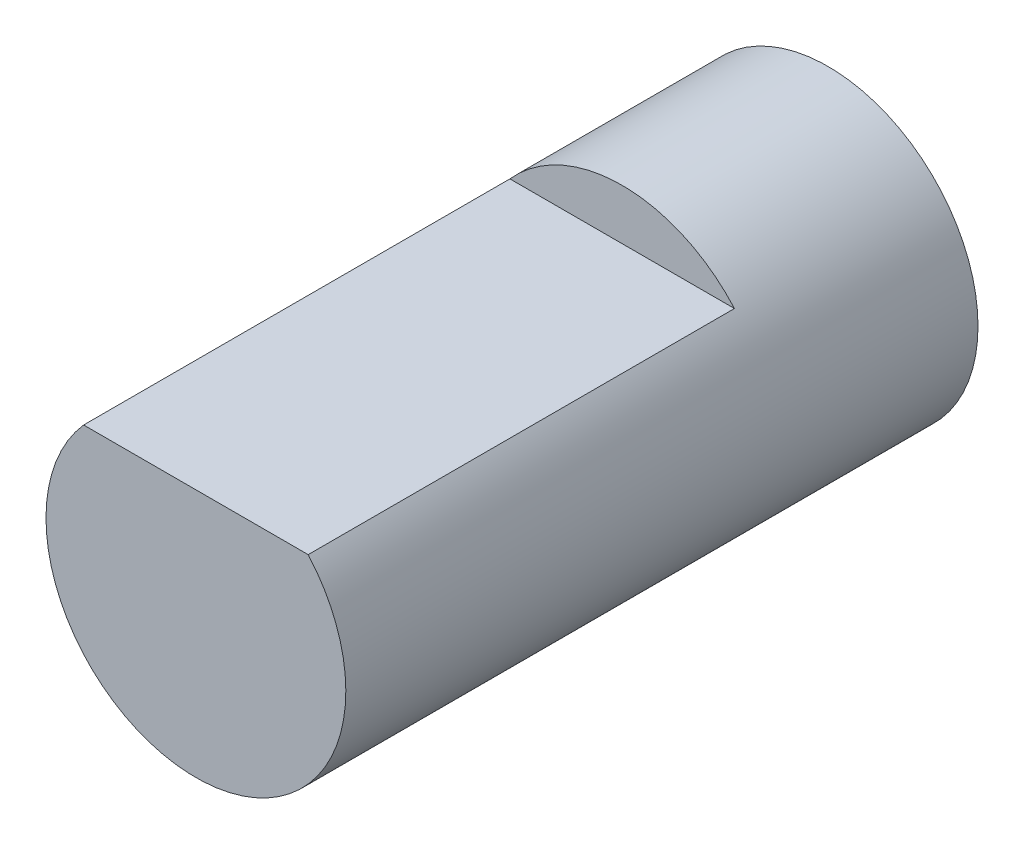
ISO-10303-21;
HEADER;
FILE_DESCRIPTION(('STEP AP214'),'2;1');
FILE_NAME('part.step','',(''),(''),'','','');
FILE_SCHEMA(('AUTOMOTIVE_DESIGN { 1 0 10303 214 1 1 1 1 }'));
ENDSEC;
DATA;
#1=APPLICATION_CONTEXT('core data for automotive mechanical design processes');
#2=APPLICATION_PROTOCOL_DEFINITION('international standard','automotive_design',2000,#1);
#3=PRODUCT_CONTEXT('',#1,'mechanical');
#4=PRODUCT('Part','Part','',(#3));
#5=PRODUCT_RELATED_PRODUCT_CATEGORY('part','',(#4));
#6=PRODUCT_DEFINITION_FORMATION('','',#4);
#7=PRODUCT_DEFINITION_CONTEXT('part definition',#1,'design');
#8=PRODUCT_DEFINITION('design','',#6,#7);
#9=PRODUCT_DEFINITION_SHAPE('','',#8);
#10=(LENGTH_UNIT() NAMED_UNIT(*) SI_UNIT(.MILLI.,.METRE.));
#11=(NAMED_UNIT(*) PLANE_ANGLE_UNIT() SI_UNIT($,.RADIAN.));
#12=(NAMED_UNIT(*) SI_UNIT($,.STERADIAN.) SOLID_ANGLE_UNIT());
#13=UNCERTAINTY_MEASURE_WITH_UNIT(LENGTH_MEASURE(1.E-05),#10,'distance_accuracy_value','');
#14=(GEOMETRIC_REPRESENTATION_CONTEXT(3) GLOBAL_UNCERTAINTY_ASSIGNED_CONTEXT((#13)) GLOBAL_UNIT_ASSIGNED_CONTEXT((#10,
#11,#12)) REPRESENTATION_CONTEXT('',''));
#15=CARTESIAN_POINT('',(0.,0.,0.));
#16=DIRECTION('',(0.,0.,1.));
#17=DIRECTION('',(1.,0.,0.));
#18=AXIS2_PLACEMENT_3D('',#15,#16,#17);
#19=CARTESIAN_POINT('',(0.,0.,17.5));
#20=DIRECTION('',(0.,0.,-1.));
#21=DIRECTION('',(-1.,0.,0.));
#22=AXIS2_PLACEMENT_3D('',#19,#20,#21);
#23=CYLINDRICAL_SURFACE('',#22,4.15);
#24=CARTESIAN_POINT('',(0.,0.,17.5));
#25=DIRECTION('',(0.,0.,1.));
#26=DIRECTION('',(1.,0.,0.));
#27=AXIS2_PLACEMENT_3D('',#24,#25,#26);
#28=CIRCLE('',#27,4.15);
#29=CARTESIAN_POINT('',(-3.10805405358401,2.75,17.5));
#30=VERTEX_POINT('',#29);
#31=CARTESIAN_POINT('',(3.10805405358401,2.75,17.5));
#32=VERTEX_POINT('',#31);
#33=EDGE_CURVE('E65',#30,#32,#28,.T.);
#34=ORIENTED_EDGE('',*,*,#33,.F.);
#35=DIRECTION('',(0.,0.,-1.));
#36=VECTOR('',#35,1.);
#37=CARTESIAN_POINT('',(-3.10805405358401,2.75,17.5));
#38=LINE('',#37,#36);
#39=CARTESIAN_POINT('',(-3.10805405358401,2.75,5.7));
#40=VERTEX_POINT('',#39);
#41=EDGE_CURVE('E51',#30,#40,#38,.T.);
#42=ORIENTED_EDGE('',*,*,#41,.T.);
#43=CARTESIAN_POINT('',(0.,0.,5.7));
#44=DIRECTION('',(0.,0.,1.));
#45=DIRECTION('',(1.,0.,0.));
#46=AXIS2_PLACEMENT_3D('',#43,#44,#45);
#47=CIRCLE('',#46,4.15);
#48=CARTESIAN_POINT('',(3.10805405358401,2.75,5.7));
#49=VERTEX_POINT('',#48);
#50=EDGE_CURVE('E11',#49,#40,#47,.T.);
#51=ORIENTED_EDGE('',*,*,#50,.F.);
#52=DIRECTION('',(0.,0.,-1.));
#53=VECTOR('',#52,1.);
#54=CARTESIAN_POINT('',(3.10805405358401,2.75,17.5));
#55=LINE('',#54,#53);
#56=EDGE_CURVE('E56',#49,#32,#55,.F.);
#57=ORIENTED_EDGE('',*,*,#56,.T.);
#58=EDGE_LOOP('',(#34,#42,#51,#57));
#59=FACE_BOUND('',#58,.T.);
#60=CARTESIAN_POINT('',(0.,0.,0.));
#61=DIRECTION('',(0.,0.,1.));
#62=DIRECTION('',(1.,0.,0.));
#63=AXIS2_PLACEMENT_3D('',#60,#61,#62);
#64=CIRCLE('',#63,4.15);
#65=CARTESIAN_POINT('',(4.15,0.,0.));
#66=VERTEX_POINT('',#65);
#67=EDGE_CURVE('E72',#66,#66,#64,.T.);
#68=ORIENTED_EDGE('',*,*,#67,.T.);
#69=EDGE_LOOP('',(#68));
#70=FACE_BOUND('',#69,.T.);
#71=ADVANCED_FACE('F37',(#59,#70),#23,.T.);
#72=CARTESIAN_POINT('',(0.,0.,17.5));
#73=DIRECTION('',(0.,0.,1.));
#74=DIRECTION('',(1.,0.,0.));
#75=AXIS2_PLACEMENT_3D('',#72,#73,#74);
#76=PLANE('',#75);
#77=DIRECTION('',(1.,0.,0.));
#78=VECTOR('',#77,1.);
#79=CARTESIAN_POINT('',(0.,2.75,17.5));
#80=LINE('',#79,#78);
#81=EDGE_CURVE('E44',#30,#32,#80,.T.);
#82=ORIENTED_EDGE('',*,*,#81,.F.);
#83=ORIENTED_EDGE('',*,*,#33,.T.);
#84=EDGE_LOOP('',(#82,#83));
#85=FACE_BOUND('',#84,.T.);
#86=ADVANCED_FACE('F71',(#85),#76,.T.);
#87=CARTESIAN_POINT('',(0.,0.,0.));
#88=DIRECTION('',(0.,0.,1.));
#89=DIRECTION('',(1.,0.,0.));
#90=AXIS2_PLACEMENT_3D('',#87,#88,#89);
#91=PLANE('',#90);
#92=ORIENTED_EDGE('',*,*,#67,.F.);
#93=EDGE_LOOP('',(#92));
#94=FACE_BOUND('',#93,.T.);
#95=ADVANCED_FACE('F81',(#94),#91,.F.);
#96=CARTESIAN_POINT('',(0.,0.,5.7));
#97=DIRECTION('',(0.,0.,1.));
#98=DIRECTION('',(1.,0.,0.));
#99=AXIS2_PLACEMENT_3D('',#96,#97,#98);
#100=PLANE('',#99);
#101=ORIENTED_EDGE('',*,*,#50,.T.);
#102=DIRECTION('',(1.,0.,0.));
#103=VECTOR('',#102,1.);
#104=CARTESIAN_POINT('',(0.,2.75,5.7));
#105=LINE('',#104,#103);
#106=EDGE_CURVE('E69',#40,#49,#105,.T.);
#107=ORIENTED_EDGE('',*,*,#106,.T.);
#108=EDGE_LOOP('',(#101,#107));
#109=FACE_BOUND('',#108,.T.);
#110=ADVANCED_FACE('F79',(#109),#100,.T.);
#111=CARTESIAN_POINT('',(0.,2.75,5.7));
#112=DIRECTION('',(0.,-1.,0.));
#113=DIRECTION('',(0.,0.,-1.));
#114=AXIS2_PLACEMENT_3D('',#111,#112,#113);
#115=PLANE('',#114);
#116=ORIENTED_EDGE('',*,*,#81,.T.);
#117=ORIENTED_EDGE('',*,*,#56,.F.);
#118=ORIENTED_EDGE('',*,*,#106,.F.);
#119=ORIENTED_EDGE('',*,*,#41,.F.);
#120=EDGE_LOOP('',(#116,#117,#118,#119));
#121=FACE_BOUND('',#120,.T.);
#122=ADVANCED_FACE('F61',(#121),#115,.F.);
#123=CLOSED_SHELL('',(#71,#86,#95,#110,#122));
#124=MANIFOLD_SOLID_BREP('B2',#123);
#125=ADVANCED_BREP_SHAPE_REPRESENTATION('',(#18,#124),#14);
#126=SHAPE_DEFINITION_REPRESENTATION(#9,#125);
ENDSEC;
END-ISO-10303-21;
